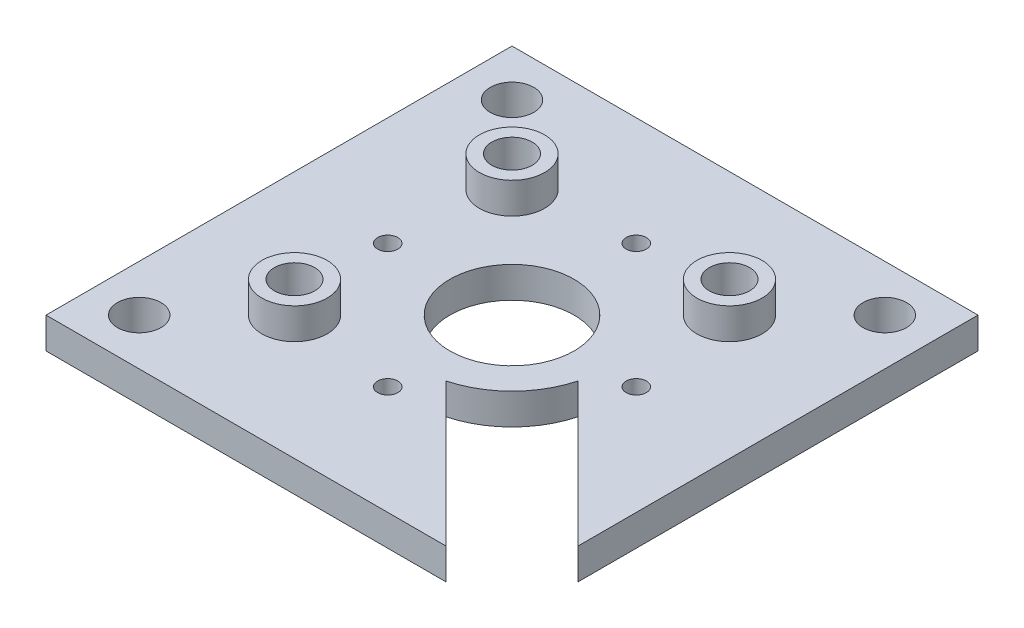
ISO-10303-21;
HEADER;
FILE_DESCRIPTION(('STEP AP214'),'2;1');
FILE_NAME('part.step','',(''),(''),'','','');
FILE_SCHEMA(('AUTOMOTIVE_DESIGN { 1 0 10303 214 1 1 1 1 }'));
ENDSEC;
DATA;
#1=APPLICATION_CONTEXT('core data for automotive mechanical design processes');
#2=APPLICATION_PROTOCOL_DEFINITION('international standard','automotive_design',2000,#1);
#3=PRODUCT_CONTEXT('',#1,'mechanical');
#4=PRODUCT('Part','Part','',(#3));
#5=PRODUCT_RELATED_PRODUCT_CATEGORY('part','',(#4));
#6=PRODUCT_DEFINITION_FORMATION('','',#4);
#7=PRODUCT_DEFINITION_CONTEXT('part definition',#1,'design');
#8=PRODUCT_DEFINITION('design','',#6,#7);
#9=PRODUCT_DEFINITION_SHAPE('','',#8);
#10=(LENGTH_UNIT() NAMED_UNIT(*) SI_UNIT(.MILLI.,.METRE.));
#11=(NAMED_UNIT(*) PLANE_ANGLE_UNIT() SI_UNIT($,.RADIAN.));
#12=(NAMED_UNIT(*) SI_UNIT($,.STERADIAN.) SOLID_ANGLE_UNIT());
#13=UNCERTAINTY_MEASURE_WITH_UNIT(LENGTH_MEASURE(1.E-05),#10,'distance_accuracy_value','');
#14=(GEOMETRIC_REPRESENTATION_CONTEXT(3) GLOBAL_UNCERTAINTY_ASSIGNED_CONTEXT((#13)) GLOBAL_UNIT_ASSIGNED_CONTEXT((#10,
#11,#12)) REPRESENTATION_CONTEXT('',''));
#15=CARTESIAN_POINT('',(0.,0.,0.));
#16=DIRECTION('',(0.,0.,1.));
#17=DIRECTION('',(1.,0.,0.));
#18=AXIS2_PLACEMENT_3D('',#15,#16,#17);
#19=CARTESIAN_POINT('',(0.,0.,0.));
#20=DIRECTION('',(0.,1.,0.));
#21=DIRECTION('',(0.,0.,1.));
#22=AXIS2_PLACEMENT_3D('',#19,#20,#21);
#23=PLANE('',#22);
#24=CARTESIAN_POINT('',(8.,0.,0.));
#25=DIRECTION('',(0.,1.,0.));
#26=DIRECTION('',(0.,0.,1.));
#27=AXIS2_PLACEMENT_3D('',#24,#25,#26);
#28=CIRCLE('',#27,0.649999999999999);
#29=CARTESIAN_POINT('',(8.,0.,0.649999999999999));
#30=VERTEX_POINT('',#29);
#31=EDGE_CURVE('E142',#30,#30,#28,.T.);
#32=ORIENTED_EDGE('',*,*,#31,.T.);
#33=EDGE_LOOP('',(#32));
#34=FACE_BOUND('',#33,.T.);
#35=CARTESIAN_POINT('',(0.,0.,8.));
#36=DIRECTION('',(0.,1.,0.));
#37=DIRECTION('',(0.,0.,1.));
#38=AXIS2_PLACEMENT_3D('',#35,#36,#37);
#39=CIRCLE('',#38,0.649999999999998);
#40=CARTESIAN_POINT('',(0.,0.,8.65));
#41=VERTEX_POINT('',#40);
#42=EDGE_CURVE('E147',#41,#41,#39,.T.);
#43=ORIENTED_EDGE('',*,*,#42,.T.);
#44=EDGE_LOOP('',(#43));
#45=FACE_BOUND('',#44,.T.);
#46=CARTESIAN_POINT('',(-8.,0.,0.));
#47=DIRECTION('',(0.,1.,0.));
#48=DIRECTION('',(0.,0.,1.));
#49=AXIS2_PLACEMENT_3D('',#46,#47,#48);
#50=CIRCLE('',#49,0.649999999999999);
#51=CARTESIAN_POINT('',(-8.,0.,0.649999999999944));
#52=VERTEX_POINT('',#51);
#53=EDGE_CURVE('E245',#52,#52,#50,.T.);
#54=ORIENTED_EDGE('',*,*,#53,.T.);
#55=EDGE_LOOP('',(#54));
#56=FACE_BOUND('',#55,.T.);
#57=CARTESIAN_POINT('',(0.,0.,-8.));
#58=DIRECTION('',(0.,1.,0.));
#59=DIRECTION('',(0.,0.,1.));
#60=AXIS2_PLACEMENT_3D('',#57,#58,#59);
#61=CIRCLE('',#60,0.649999999999999);
#62=CARTESIAN_POINT('',(0.,0.,-7.35));
#63=VERTEX_POINT('',#62);
#64=EDGE_CURVE('E238',#63,#63,#61,.T.);
#65=ORIENTED_EDGE('',*,*,#64,.T.);
#66=EDGE_LOOP('',(#65));
#67=FACE_BOUND('',#66,.T.);
#68=CARTESIAN_POINT('',(0.,0.,0.));
#69=DIRECTION('',(0.,1.,0.));
#70=DIRECTION('',(0.,0.,1.));
#71=AXIS2_PLACEMENT_3D('',#68,#69,#70);
#72=CIRCLE('',#71,4.);
#73=CARTESIAN_POINT('',(0.,0.,4.));
#74=VERTEX_POINT('',#73);
#75=EDGE_CURVE('E234',#74,#74,#72,.T.);
#76=ORIENTED_EDGE('',*,*,#75,.T.);
#77=EDGE_LOOP('',(#76));
#78=FACE_BOUND('',#77,.T.);
#79=CARTESIAN_POINT('',(12.,0.,-12.));
#80=DIRECTION('',(0.,1.,0.));
#81=DIRECTION('',(0.,0.,1.));
#82=AXIS2_PLACEMENT_3D('',#79,#80,#81);
#83=CIRCLE('',#82,1.4);
#84=CARTESIAN_POINT('',(12.,0.,-10.6));
#85=VERTEX_POINT('',#84);
#86=EDGE_CURVE('E229',#85,#85,#83,.T.);
#87=ORIENTED_EDGE('',*,*,#86,.T.);
#88=EDGE_LOOP('',(#87));
#89=FACE_BOUND('',#88,.T.);
#90=CARTESIAN_POINT('',(-12.,0.,-12.));
#91=DIRECTION('',(0.,1.,0.));
#92=DIRECTION('',(0.,0.,1.));
#93=AXIS2_PLACEMENT_3D('',#90,#91,#92);
#94=CIRCLE('',#93,1.4);
#95=CARTESIAN_POINT('',(-12.,0.,-10.6));
#96=VERTEX_POINT('',#95);
#97=EDGE_CURVE('E223',#96,#96,#94,.F.);
#98=ORIENTED_EDGE('',*,*,#97,.F.);
#99=EDGE_LOOP('',(#98));
#100=FACE_BOUND('',#99,.T.);
#101=CARTESIAN_POINT('',(-12.,0.,12.));
#102=DIRECTION('',(0.,1.,0.));
#103=DIRECTION('',(0.,0.,1.));
#104=AXIS2_PLACEMENT_3D('',#101,#102,#103);
#105=CIRCLE('',#104,1.4);
#106=CARTESIAN_POINT('',(-12.,0.,13.4));
#107=VERTEX_POINT('',#106);
#108=EDGE_CURVE('E222',#107,#107,#105,.T.);
#109=ORIENTED_EDGE('',*,*,#108,.T.);
#110=EDGE_LOOP('',(#109));
#111=FACE_BOUND('',#110,.T.);
#112=CARTESIAN_POINT('',(-7.00000000000001,0.,-6.99999999999999));
#113=DIRECTION('',(0.,1.,0.));
#114=DIRECTION('',(0.,0.,1.));
#115=AXIS2_PLACEMENT_3D('',#112,#113,#114);
#116=CIRCLE('',#115,1.3);
#117=CARTESIAN_POINT('',(-7.00000000000001,0.,-5.69999999999999));
#118=VERTEX_POINT('',#117);
#119=EDGE_CURVE('E319',#118,#118,#116,.F.);
#120=ORIENTED_EDGE('',*,*,#119,.F.);
#121=EDGE_LOOP('',(#120));
#122=FACE_BOUND('',#121,.T.);
#123=CARTESIAN_POINT('',(6.99999999999999,0.,-7.00000000000002));
#124=DIRECTION('',(0.,1.,0.));
#125=DIRECTION('',(0.,0.,1.));
#126=AXIS2_PLACEMENT_3D('',#123,#124,#125);
#127=CIRCLE('',#126,1.3);
#128=CARTESIAN_POINT('',(6.99999999999999,0.,-5.70000000000002));
#129=VERTEX_POINT('',#128);
#130=EDGE_CURVE('E302',#129,#129,#127,.F.);
#131=ORIENTED_EDGE('',*,*,#130,.F.);
#132=EDGE_LOOP('',(#131));
#133=FACE_BOUND('',#132,.T.);
#134=CARTESIAN_POINT('',(-6.99999999999999,0.,7.00000000000002));
#135=DIRECTION('',(0.,1.,0.));
#136=DIRECTION('',(0.,0.,1.));
#137=AXIS2_PLACEMENT_3D('',#134,#135,#136);
#138=CIRCLE('',#137,1.3);
#139=CARTESIAN_POINT('',(-6.99999999999999,0.,8.30000000000002));
#140=VERTEX_POINT('',#139);
#141=EDGE_CURVE('E313',#140,#140,#138,.F.);
#142=ORIENTED_EDGE('',*,*,#141,.F.);
#143=EDGE_LOOP('',(#142));
#144=FACE_BOUND('',#143,.T.);
#145=DIRECTION('',(-0.707106781186548,0.,-0.707106781186548));
#146=VECTOR('',#145,1.);
#147=CARTESIAN_POINT('',(-2.12132034355964,0.,2.12132034355964));
#148=LINE('',#147,#146);
#149=CARTESIAN_POINT('',(10.7573593128807,0.,15.));
#150=VERTEX_POINT('',#149);
#151=CARTESIAN_POINT('',(1.55291427061513,0.,5.79555495773441));
#152=VERTEX_POINT('',#151);
#153=EDGE_CURVE('E304',#150,#152,#148,.T.);
#154=ORIENTED_EDGE('',*,*,#153,.F.);
#155=DIRECTION('',(1.,0.,0.));
#156=VECTOR('',#155,1.);
#157=CARTESIAN_POINT('',(0.,0.,15.));
#158=LINE('',#157,#156);
#159=CARTESIAN_POINT('',(-15.,0.,15.));
#160=VERTEX_POINT('',#159);
#161=EDGE_CURVE('E94',#160,#150,#158,.T.);
#162=ORIENTED_EDGE('',*,*,#161,.F.);
#163=DIRECTION('',(0.,0.,1.));
#164=VECTOR('',#163,1.);
#165=CARTESIAN_POINT('',(-15.,0.,0.));
#166=LINE('',#165,#164);
#167=CARTESIAN_POINT('',(-15.,0.,-15.));
#168=VERTEX_POINT('',#167);
#169=EDGE_CURVE('E143',#168,#160,#166,.T.);
#170=ORIENTED_EDGE('',*,*,#169,.F.);
#171=DIRECTION('',(1.,0.,0.));
#172=VECTOR('',#171,1.);
#173=CARTESIAN_POINT('',(0.,0.,-15.));
#174=LINE('',#173,#172);
#175=CARTESIAN_POINT('',(15.,0.,-15.));
#176=VERTEX_POINT('',#175);
#177=EDGE_CURVE('E136',#168,#176,#174,.T.);
#178=ORIENTED_EDGE('',*,*,#177,.T.);
#179=DIRECTION('',(0.,0.,1.));
#180=VECTOR('',#179,1.);
#181=CARTESIAN_POINT('',(15.,0.,0.));
#182=LINE('',#181,#180);
#183=CARTESIAN_POINT('',(15.,0.,10.7573593128807));
#184=VERTEX_POINT('',#183);
#185=EDGE_CURVE('E131',#176,#184,#182,.T.);
#186=ORIENTED_EDGE('',*,*,#185,.T.);
#187=DIRECTION('',(-0.707106781186548,0.,-0.707106781186548));
#188=VECTOR('',#187,1.);
#189=CARTESIAN_POINT('',(2.12132034355964,0.,-2.12132034355964));
#190=LINE('',#189,#188);
#191=CARTESIAN_POINT('',(5.79555495773441,0.,1.55291427061513));
#192=VERTEX_POINT('',#191);
#193=EDGE_CURVE('E118',#184,#192,#190,.T.);
#194=ORIENTED_EDGE('',*,*,#193,.T.);
#195=CARTESIAN_POINT('',(0.,0.,0.));
#196=DIRECTION('',(0.,1.,0.));
#197=DIRECTION('',(0.,0.,1.));
#198=AXIS2_PLACEMENT_3D('',#195,#196,#197);
#199=CIRCLE('',#198,6.00000000000001);
#200=EDGE_CURVE('E305',#152,#192,#199,.T.);
#201=ORIENTED_EDGE('',*,*,#200,.F.);
#202=EDGE_LOOP('',(#154,#162,#170,#178,#186,#194,#201));
#203=FACE_BOUND('',#202,.T.);
#204=ADVANCED_FACE('F46',(#34,#45,#56,#67,#78,#89,#100,#111,#122,#133,#144,#203),#23,.F.);
#205=CARTESIAN_POINT('',(15.,2.,0.));
#206=DIRECTION('',(1.,0.,0.));
#207=DIRECTION('',(0.,0.,-1.));
#208=AXIS2_PLACEMENT_3D('',#205,#206,#207);
#209=PLANE('',#208);
#210=DIRECTION('',(0.,1.,0.));
#211=VECTOR('',#210,1.);
#212=CARTESIAN_POINT('',(15.,-19.0170510128898,10.7573593128807));
#213=LINE('',#212,#211);
#214=CARTESIAN_POINT('',(15.,2.,10.7573593128807));
#215=VERTEX_POINT('',#214);
#216=EDGE_CURVE('E124',#184,#215,#213,.T.);
#217=ORIENTED_EDGE('',*,*,#216,.F.);
#218=ORIENTED_EDGE('',*,*,#185,.F.);
#219=DIRECTION('',(0.,-1.,0.));
#220=VECTOR('',#219,1.);
#221=CARTESIAN_POINT('',(15.,2.,-15.));
#222=LINE('',#221,#220);
#223=CARTESIAN_POINT('',(15.,2.,-15.));
#224=VERTEX_POINT('',#223);
#225=EDGE_CURVE('E49',#224,#176,#222,.T.);
#226=ORIENTED_EDGE('',*,*,#225,.F.);
#227=DIRECTION('',(0.,0.,1.));
#228=VECTOR('',#227,1.);
#229=CARTESIAN_POINT('',(15.,2.,0.));
#230=LINE('',#229,#228);
#231=EDGE_CURVE('E134',#224,#215,#230,.T.);
#232=ORIENTED_EDGE('',*,*,#231,.T.);
#233=EDGE_LOOP('',(#217,#218,#226,#232));
#234=FACE_BOUND('',#233,.T.);
#235=ADVANCED_FACE('F126',(#234),#209,.T.);
#236=CARTESIAN_POINT('',(0.,2.,-15.));
#237=DIRECTION('',(0.,0.,-1.));
#238=DIRECTION('',(-1.,0.,0.));
#239=AXIS2_PLACEMENT_3D('',#236,#237,#238);
#240=PLANE('',#239);
#241=ORIENTED_EDGE('',*,*,#177,.F.);
#242=DIRECTION('',(0.,-1.,0.));
#243=VECTOR('',#242,1.);
#244=CARTESIAN_POINT('',(-15.,2.,-15.));
#245=LINE('',#244,#243);
#246=CARTESIAN_POINT('',(-15.,2.,-15.));
#247=VERTEX_POINT('',#246);
#248=EDGE_CURVE('E158',#247,#168,#245,.T.);
#249=ORIENTED_EDGE('',*,*,#248,.F.);
#250=DIRECTION('',(1.,0.,0.));
#251=VECTOR('',#250,1.);
#252=CARTESIAN_POINT('',(0.,2.,-15.));
#253=LINE('',#252,#251);
#254=EDGE_CURVE('E212',#247,#224,#253,.T.);
#255=ORIENTED_EDGE('',*,*,#254,.T.);
#256=ORIENTED_EDGE('',*,*,#225,.T.);
#257=EDGE_LOOP('',(#241,#249,#255,#256));
#258=FACE_BOUND('',#257,.T.);
#259=ADVANCED_FACE('F274',(#258),#240,.T.);
#260=CARTESIAN_POINT('',(-15.,2.,0.));
#261=DIRECTION('',(1.,0.,0.));
#262=DIRECTION('',(0.,0.,-1.));
#263=AXIS2_PLACEMENT_3D('',#260,#261,#262);
#264=PLANE('',#263);
#265=ORIENTED_EDGE('',*,*,#169,.T.);
#266=DIRECTION('',(0.,-1.,0.));
#267=VECTOR('',#266,1.);
#268=CARTESIAN_POINT('',(-15.,2.,15.));
#269=LINE('',#268,#267);
#270=CARTESIAN_POINT('',(-15.,2.,15.));
#271=VERTEX_POINT('',#270);
#272=EDGE_CURVE('E160',#271,#160,#269,.T.);
#273=ORIENTED_EDGE('',*,*,#272,.F.);
#274=DIRECTION('',(0.,0.,1.));
#275=VECTOR('',#274,1.);
#276=CARTESIAN_POINT('',(-15.,2.,0.));
#277=LINE('',#276,#275);
#278=EDGE_CURVE('E216',#247,#271,#277,.T.);
#279=ORIENTED_EDGE('',*,*,#278,.F.);
#280=ORIENTED_EDGE('',*,*,#248,.T.);
#281=EDGE_LOOP('',(#265,#273,#279,#280));
#282=FACE_BOUND('',#281,.T.);
#283=ADVANCED_FACE('F282',(#282),#264,.F.);
#284=CARTESIAN_POINT('',(0.,2.,15.));
#285=DIRECTION('',(0.,0.,-1.));
#286=DIRECTION('',(-1.,0.,0.));
#287=AXIS2_PLACEMENT_3D('',#284,#285,#286);
#288=PLANE('',#287);
#289=ORIENTED_EDGE('',*,*,#161,.T.);
#290=DIRECTION('',(0.,1.,0.));
#291=VECTOR('',#290,1.);
#292=CARTESIAN_POINT('',(10.7573593128807,-19.0170510128898,15.));
#293=LINE('',#292,#291);
#294=CARTESIAN_POINT('',(10.7573593128807,2.,15.));
#295=VERTEX_POINT('',#294);
#296=EDGE_CURVE('E135',#150,#295,#293,.T.);
#297=ORIENTED_EDGE('',*,*,#296,.T.);
#298=DIRECTION('',(1.,0.,0.));
#299=VECTOR('',#298,1.);
#300=CARTESIAN_POINT('',(0.,2.,15.));
#301=LINE('',#300,#299);
#302=EDGE_CURVE('E75',#271,#295,#301,.T.);
#303=ORIENTED_EDGE('',*,*,#302,.F.);
#304=ORIENTED_EDGE('',*,*,#272,.T.);
#305=EDGE_LOOP('',(#289,#297,#303,#304));
#306=FACE_BOUND('',#305,.T.);
#307=ADVANCED_FACE('F263',(#306),#288,.F.);
#308=CARTESIAN_POINT('',(8.,2.,0.));
#309=DIRECTION('',(0.,-1.,0.));
#310=DIRECTION('',(0.,0.,-1.));
#311=AXIS2_PLACEMENT_3D('',#308,#309,#310);
#312=CYLINDRICAL_SURFACE('',#311,0.649999999999999);
#313=CARTESIAN_POINT('',(8.,2.,0.));
#314=DIRECTION('',(0.,1.,0.));
#315=DIRECTION('',(0.,0.,1.));
#316=AXIS2_PLACEMENT_3D('',#313,#314,#315);
#317=CIRCLE('',#316,0.649999999999999);
#318=CARTESIAN_POINT('',(8.,2.,0.649999999999999));
#319=VERTEX_POINT('',#318);
#320=EDGE_CURVE('E210',#319,#319,#317,.T.);
#321=ORIENTED_EDGE('',*,*,#320,.T.);
#322=EDGE_LOOP('',(#321));
#323=FACE_BOUND('',#322,.T.);
#324=ORIENTED_EDGE('',*,*,#31,.F.);
#325=EDGE_LOOP('',(#324));
#326=FACE_BOUND('',#325,.T.);
#327=ADVANCED_FACE('F251',(#323,#326),#312,.F.);
#328=CARTESIAN_POINT('',(0.,2.,8.));
#329=DIRECTION('',(0.,-1.,0.));
#330=DIRECTION('',(0.,0.,-1.));
#331=AXIS2_PLACEMENT_3D('',#328,#329,#330);
#332=CYLINDRICAL_SURFACE('',#331,0.649999999999998);
#333=CARTESIAN_POINT('',(0.,2.,8.));
#334=DIRECTION('',(0.,1.,0.));
#335=DIRECTION('',(0.,0.,1.));
#336=AXIS2_PLACEMENT_3D('',#333,#334,#335);
#337=CIRCLE('',#336,0.649999999999998);
#338=CARTESIAN_POINT('',(0.,2.,8.65));
#339=VERTEX_POINT('',#338);
#340=EDGE_CURVE('E205',#339,#339,#337,.T.);
#341=ORIENTED_EDGE('',*,*,#340,.T.);
#342=EDGE_LOOP('',(#341));
#343=FACE_BOUND('',#342,.T.);
#344=ORIENTED_EDGE('',*,*,#42,.F.);
#345=EDGE_LOOP('',(#344));
#346=FACE_BOUND('',#345,.T.);
#347=ADVANCED_FACE('F252',(#343,#346),#332,.F.);
#348=CARTESIAN_POINT('',(-8.,2.,0.));
#349=DIRECTION('',(0.,-1.,0.));
#350=DIRECTION('',(0.,0.,-1.));
#351=AXIS2_PLACEMENT_3D('',#348,#349,#350);
#352=CYLINDRICAL_SURFACE('',#351,0.649999999999999);
#353=CARTESIAN_POINT('',(-8.,2.,0.));
#354=DIRECTION('',(0.,1.,0.));
#355=DIRECTION('',(0.,0.,1.));
#356=AXIS2_PLACEMENT_3D('',#353,#354,#355);
#357=CIRCLE('',#356,0.649999999999999);
#358=CARTESIAN_POINT('',(-8.,2.,0.649999999999944));
#359=VERTEX_POINT('',#358);
#360=EDGE_CURVE('E198',#359,#359,#357,.T.);
#361=ORIENTED_EDGE('',*,*,#360,.T.);
#362=EDGE_LOOP('',(#361));
#363=FACE_BOUND('',#362,.T.);
#364=ORIENTED_EDGE('',*,*,#53,.F.);
#365=EDGE_LOOP('',(#364));
#366=FACE_BOUND('',#365,.T.);
#367=ADVANCED_FACE('F254',(#363,#366),#352,.F.);
#368=CARTESIAN_POINT('',(0.,2.,-8.));
#369=DIRECTION('',(0.,-1.,0.));
#370=DIRECTION('',(0.,0.,-1.));
#371=AXIS2_PLACEMENT_3D('',#368,#369,#370);
#372=CYLINDRICAL_SURFACE('',#371,0.649999999999999);
#373=CARTESIAN_POINT('',(0.,2.,-8.));
#374=DIRECTION('',(0.,1.,0.));
#375=DIRECTION('',(0.,0.,1.));
#376=AXIS2_PLACEMENT_3D('',#373,#374,#375);
#377=CIRCLE('',#376,0.649999999999999);
#378=CARTESIAN_POINT('',(0.,2.,-7.35));
#379=VERTEX_POINT('',#378);
#380=EDGE_CURVE('E191',#379,#379,#377,.T.);
#381=ORIENTED_EDGE('',*,*,#380,.T.);
#382=EDGE_LOOP('',(#381));
#383=FACE_BOUND('',#382,.T.);
#384=ORIENTED_EDGE('',*,*,#64,.F.);
#385=EDGE_LOOP('',(#384));
#386=FACE_BOUND('',#385,.T.);
#387=ADVANCED_FACE('F261',(#383,#386),#372,.F.);
#388=CARTESIAN_POINT('',(0.,2.,0.));
#389=DIRECTION('',(0.,-1.,0.));
#390=DIRECTION('',(0.,0.,-1.));
#391=AXIS2_PLACEMENT_3D('',#388,#389,#390);
#392=CYLINDRICAL_SURFACE('',#391,4.);
#393=CARTESIAN_POINT('',(0.,2.,0.));
#394=DIRECTION('',(0.,1.,0.));
#395=DIRECTION('',(0.,0.,1.));
#396=AXIS2_PLACEMENT_3D('',#393,#394,#395);
#397=CIRCLE('',#396,4.);
#398=CARTESIAN_POINT('',(0.,2.,4.));
#399=VERTEX_POINT('',#398);
#400=EDGE_CURVE('E193',#399,#399,#397,.T.);
#401=ORIENTED_EDGE('',*,*,#400,.T.);
#402=EDGE_LOOP('',(#401));
#403=FACE_BOUND('',#402,.T.);
#404=ORIENTED_EDGE('',*,*,#75,.F.);
#405=EDGE_LOOP('',(#404));
#406=FACE_BOUND('',#405,.T.);
#407=ADVANCED_FACE('F476',(#403,#406),#392,.F.);
#408=CARTESIAN_POINT('',(12.,2.,-12.));
#409=DIRECTION('',(0.,-1.,0.));
#410=DIRECTION('',(0.,0.,-1.));
#411=AXIS2_PLACEMENT_3D('',#408,#409,#410);
#412=CYLINDRICAL_SURFACE('',#411,1.4);
#413=CARTESIAN_POINT('',(12.,2.,-12.));
#414=DIRECTION('',(0.,1.,0.));
#415=DIRECTION('',(0.,0.,1.));
#416=AXIS2_PLACEMENT_3D('',#413,#414,#415);
#417=CIRCLE('',#416,1.4);
#418=CARTESIAN_POINT('',(12.,2.,-10.6));
#419=VERTEX_POINT('',#418);
#420=EDGE_CURVE('E190',#419,#419,#417,.T.);
#421=ORIENTED_EDGE('',*,*,#420,.T.);
#422=EDGE_LOOP('',(#421));
#423=FACE_BOUND('',#422,.T.);
#424=ORIENTED_EDGE('',*,*,#86,.F.);
#425=EDGE_LOOP('',(#424));
#426=FACE_BOUND('',#425,.T.);
#427=ADVANCED_FACE('F488',(#423,#426),#412,.F.);
#428=CARTESIAN_POINT('',(-12.,2.,-12.));
#429=DIRECTION('',(0.,-1.,0.));
#430=DIRECTION('',(0.,0.,-1.));
#431=AXIS2_PLACEMENT_3D('',#428,#429,#430);
#432=CYLINDRICAL_SURFACE('',#431,1.4);
#433=CARTESIAN_POINT('',(-12.,2.,-12.));
#434=DIRECTION('',(0.,1.,0.));
#435=DIRECTION('',(0.,0.,1.));
#436=AXIS2_PLACEMENT_3D('',#433,#434,#435);
#437=CIRCLE('',#436,1.4);
#438=CARTESIAN_POINT('',(-12.,2.,-10.6));
#439=VERTEX_POINT('',#438);
#440=EDGE_CURVE('E182',#439,#439,#437,.F.);
#441=ORIENTED_EDGE('',*,*,#440,.F.);
#442=EDGE_LOOP('',(#441));
#443=FACE_BOUND('',#442,.T.);
#444=ORIENTED_EDGE('',*,*,#97,.T.);
#445=EDGE_LOOP('',(#444));
#446=FACE_BOUND('',#445,.T.);
#447=ADVANCED_FACE('F496',(#443,#446),#432,.F.);
#448=CARTESIAN_POINT('',(-12.,2.,12.));
#449=DIRECTION('',(0.,-1.,0.));
#450=DIRECTION('',(0.,0.,-1.));
#451=AXIS2_PLACEMENT_3D('',#448,#449,#450);
#452=CYLINDRICAL_SURFACE('',#451,1.4);
#453=CARTESIAN_POINT('',(-12.,2.,12.));
#454=DIRECTION('',(0.,1.,0.));
#455=DIRECTION('',(0.,0.,1.));
#456=AXIS2_PLACEMENT_3D('',#453,#454,#455);
#457=CIRCLE('',#456,1.4);
#458=CARTESIAN_POINT('',(-12.,2.,13.4));
#459=VERTEX_POINT('',#458);
#460=EDGE_CURVE('E159',#459,#459,#457,.T.);
#461=ORIENTED_EDGE('',*,*,#460,.T.);
#462=EDGE_LOOP('',(#461));
#463=FACE_BOUND('',#462,.T.);
#464=ORIENTED_EDGE('',*,*,#108,.F.);
#465=EDGE_LOOP('',(#464));
#466=FACE_BOUND('',#465,.T.);
#467=ADVANCED_FACE('F48',(#463,#466),#452,.F.);
#468=CARTESIAN_POINT('',(0.,2.,0.));
#469=DIRECTION('',(0.,1.,0.));
#470=DIRECTION('',(0.,0.,1.));
#471=AXIS2_PLACEMENT_3D('',#468,#469,#470);
#472=PLANE('',#471);
#473=CARTESIAN_POINT('',(0.,2.,0.));
#474=DIRECTION('',(0.,1.,0.));
#475=DIRECTION('',(0.,0.,1.));
#476=AXIS2_PLACEMENT_3D('',#473,#474,#475);
#477=CIRCLE('',#476,6.00000000000001);
#478=CARTESIAN_POINT('',(5.79555495773441,2.,1.55291427061513));
#479=VERTEX_POINT('',#478);
#480=CARTESIAN_POINT('',(1.55291427061513,2.,5.79555495773441));
#481=VERTEX_POINT('',#480);
#482=EDGE_CURVE('E295',#479,#481,#477,.F.);
#483=ORIENTED_EDGE('',*,*,#482,.F.);
#484=DIRECTION('',(0.707106781186548,0.,0.707106781186548));
#485=VECTOR('',#484,1.);
#486=CARTESIAN_POINT('',(2.12132034355964,2.,-2.12132034355964));
#487=LINE('',#486,#485);
#488=EDGE_CURVE('E137',#479,#215,#487,.T.);
#489=ORIENTED_EDGE('',*,*,#488,.T.);
#490=ORIENTED_EDGE('',*,*,#231,.F.);
#491=ORIENTED_EDGE('',*,*,#254,.F.);
#492=ORIENTED_EDGE('',*,*,#278,.T.);
#493=ORIENTED_EDGE('',*,*,#302,.T.);
#494=DIRECTION('',(0.707106781186548,0.,0.707106781186548));
#495=VECTOR('',#494,1.);
#496=CARTESIAN_POINT('',(-2.12132034355964,2.,2.12132034355964));
#497=LINE('',#496,#495);
#498=EDGE_CURVE('E312',#481,#295,#497,.T.);
#499=ORIENTED_EDGE('',*,*,#498,.F.);
#500=EDGE_LOOP('',(#483,#489,#490,#491,#492,#493,#499));
#501=FACE_BOUND('',#500,.T.);
#502=CARTESIAN_POINT('',(-6.99999999999999,2.,7.00000000000002));
#503=DIRECTION('',(0.,1.,0.));
#504=DIRECTION('',(0.,0.,1.));
#505=AXIS2_PLACEMENT_3D('',#502,#503,#504);
#506=CIRCLE('',#505,2.1);
#507=CARTESIAN_POINT('',(-6.99999999999999,2.,9.10000000000002));
#508=VERTEX_POINT('',#507);
#509=EDGE_CURVE('E11',#508,#508,#506,.T.);
#510=ORIENTED_EDGE('',*,*,#509,.F.);
#511=EDGE_LOOP('',(#510));
#512=FACE_BOUND('',#511,.T.);
#513=CARTESIAN_POINT('',(-7.00000000000001,2.,-6.99999999999999));
#514=DIRECTION('',(0.,1.,0.));
#515=DIRECTION('',(0.,0.,1.));
#516=AXIS2_PLACEMENT_3D('',#513,#514,#515);
#517=CIRCLE('',#516,2.1);
#518=CARTESIAN_POINT('',(-7.00000000000001,2.,-4.89999999999999));
#519=VERTEX_POINT('',#518);
#520=EDGE_CURVE('E57',#519,#519,#517,.T.);
#521=ORIENTED_EDGE('',*,*,#520,.F.);
#522=EDGE_LOOP('',(#521));
#523=FACE_BOUND('',#522,.T.);
#524=CARTESIAN_POINT('',(6.99999999999999,2.,-7.00000000000002));
#525=DIRECTION('',(0.,1.,0.));
#526=DIRECTION('',(0.,0.,1.));
#527=AXIS2_PLACEMENT_3D('',#524,#525,#526);
#528=CIRCLE('',#527,2.1);
#529=CARTESIAN_POINT('',(6.99999999999999,2.,-4.90000000000002));
#530=VERTEX_POINT('',#529);
#531=EDGE_CURVE('E164',#530,#530,#528,.T.);
#532=ORIENTED_EDGE('',*,*,#531,.F.);
#533=EDGE_LOOP('',(#532));
#534=FACE_BOUND('',#533,.T.);
#535=ORIENTED_EDGE('',*,*,#460,.F.);
#536=EDGE_LOOP('',(#535));
#537=FACE_BOUND('',#536,.T.);
#538=ORIENTED_EDGE('',*,*,#440,.T.);
#539=EDGE_LOOP('',(#538));
#540=FACE_BOUND('',#539,.T.);
#541=ORIENTED_EDGE('',*,*,#420,.F.);
#542=EDGE_LOOP('',(#541));
#543=FACE_BOUND('',#542,.T.);
#544=ORIENTED_EDGE('',*,*,#400,.F.);
#545=EDGE_LOOP('',(#544));
#546=FACE_BOUND('',#545,.T.);
#547=ORIENTED_EDGE('',*,*,#380,.F.);
#548=EDGE_LOOP('',(#547));
#549=FACE_BOUND('',#548,.T.);
#550=ORIENTED_EDGE('',*,*,#360,.F.);
#551=EDGE_LOOP('',(#550));
#552=FACE_BOUND('',#551,.T.);
#553=ORIENTED_EDGE('',*,*,#340,.F.);
#554=EDGE_LOOP('',(#553));
#555=FACE_BOUND('',#554,.T.);
#556=ORIENTED_EDGE('',*,*,#320,.F.);
#557=EDGE_LOOP('',(#556));
#558=FACE_BOUND('',#557,.T.);
#559=ADVANCED_FACE('F277',(#501,#512,#523,#534,#537,#540,#543,#546,#549,#552,#555,#558),#472,.T.);
#560=CARTESIAN_POINT('',(6.99999999999999,4.,-7.00000000000002));
#561=DIRECTION('',(0.,-1.,0.));
#562=DIRECTION('',(0.,0.,-1.));
#563=AXIS2_PLACEMENT_3D('',#560,#561,#562);
#564=CYLINDRICAL_SURFACE('',#563,1.3);
#565=CARTESIAN_POINT('',(6.99999999999999,4.,-7.00000000000002));
#566=DIRECTION('',(0.,1.,0.));
#567=DIRECTION('',(0.,0.,1.));
#568=AXIS2_PLACEMENT_3D('',#565,#566,#567);
#569=CIRCLE('',#568,1.3);
#570=CARTESIAN_POINT('',(6.99999999999999,4.,-5.70000000000002));
#571=VERTEX_POINT('',#570);
#572=EDGE_CURVE('E321',#571,#571,#569,.T.);
#573=ORIENTED_EDGE('',*,*,#572,.T.);
#574=EDGE_LOOP('',(#573));
#575=FACE_BOUND('',#574,.T.);
#576=ORIENTED_EDGE('',*,*,#130,.T.);
#577=EDGE_LOOP('',(#576));
#578=FACE_BOUND('',#577,.T.);
#579=ADVANCED_FACE('F354',(#575,#578),#564,.F.);
#580=CARTESIAN_POINT('',(6.99999999999999,4.,-7.00000000000002));
#581=DIRECTION('',(0.,-1.,0.));
#582=DIRECTION('',(0.,0.,-1.));
#583=AXIS2_PLACEMENT_3D('',#580,#581,#582);
#584=CYLINDRICAL_SURFACE('',#583,2.1);
#585=CARTESIAN_POINT('',(6.99999999999999,4.,-7.00000000000002));
#586=DIRECTION('',(0.,1.,0.));
#587=DIRECTION('',(0.,0.,1.));
#588=AXIS2_PLACEMENT_3D('',#585,#586,#587);
#589=CIRCLE('',#588,2.1);
#590=CARTESIAN_POINT('',(6.99999999999999,4.,-4.90000000000002));
#591=VERTEX_POINT('',#590);
#592=EDGE_CURVE('E178',#591,#591,#589,.T.);
#593=ORIENTED_EDGE('',*,*,#592,.F.);
#594=EDGE_LOOP('',(#593));
#595=FACE_BOUND('',#594,.T.);
#596=ORIENTED_EDGE('',*,*,#531,.T.);
#597=EDGE_LOOP('',(#596));
#598=FACE_BOUND('',#597,.T.);
#599=ADVANCED_FACE('F350',(#595,#598),#584,.T.);
#600=CARTESIAN_POINT('',(0.,4.,0.));
#601=DIRECTION('',(0.,1.,0.));
#602=DIRECTION('',(0.,0.,1.));
#603=AXIS2_PLACEMENT_3D('',#600,#601,#602);
#604=PLANE('',#603);
#605=ORIENTED_EDGE('',*,*,#572,.F.);
#606=EDGE_LOOP('',(#605));
#607=FACE_BOUND('',#606,.T.);
#608=ORIENTED_EDGE('',*,*,#592,.T.);
#609=EDGE_LOOP('',(#608));
#610=FACE_BOUND('',#609,.T.);
#611=ADVANCED_FACE('F349',(#607,#610),#604,.T.);
#612=CARTESIAN_POINT('',(-7.00000000000001,4.,-6.99999999999999));
#613=DIRECTION('',(0.,-1.,0.));
#614=DIRECTION('',(0.,0.,-1.));
#615=AXIS2_PLACEMENT_3D('',#612,#613,#614);
#616=CYLINDRICAL_SURFACE('',#615,1.3);
#617=CARTESIAN_POINT('',(-7.00000000000001,4.,-6.99999999999999));
#618=DIRECTION('',(0.,1.,0.));
#619=DIRECTION('',(0.,0.,1.));
#620=AXIS2_PLACEMENT_3D('',#617,#618,#619);
#621=CIRCLE('',#620,1.3);
#622=CARTESIAN_POINT('',(-7.00000000000001,4.,-5.69999999999999));
#623=VERTEX_POINT('',#622);
#624=EDGE_CURVE('E331',#623,#623,#621,.T.);
#625=ORIENTED_EDGE('',*,*,#624,.T.);
#626=EDGE_LOOP('',(#625));
#627=FACE_BOUND('',#626,.T.);
#628=ORIENTED_EDGE('',*,*,#119,.T.);
#629=EDGE_LOOP('',(#628));
#630=FACE_BOUND('',#629,.T.);
#631=ADVANCED_FACE('F356',(#627,#630),#616,.F.);
#632=CARTESIAN_POINT('',(-7.00000000000001,4.,-6.99999999999999));
#633=DIRECTION('',(0.,-1.,0.));
#634=DIRECTION('',(0.,0.,-1.));
#635=AXIS2_PLACEMENT_3D('',#632,#633,#634);
#636=CYLINDRICAL_SURFACE('',#635,2.1);
#637=CARTESIAN_POINT('',(-7.00000000000001,4.,-6.99999999999999));
#638=DIRECTION('',(0.,1.,0.));
#639=DIRECTION('',(0.,0.,1.));
#640=AXIS2_PLACEMENT_3D('',#637,#638,#639);
#641=CIRCLE('',#640,2.1);
#642=CARTESIAN_POINT('',(-7.00000000000001,4.,-4.89999999999999));
#643=VERTEX_POINT('',#642);
#644=EDGE_CURVE('E330',#643,#643,#641,.T.);
#645=ORIENTED_EDGE('',*,*,#644,.F.);
#646=EDGE_LOOP('',(#645));
#647=FACE_BOUND('',#646,.T.);
#648=ORIENTED_EDGE('',*,*,#520,.T.);
#649=EDGE_LOOP('',(#648));
#650=FACE_BOUND('',#649,.T.);
#651=ADVANCED_FACE('F362',(#647,#650),#636,.T.);
#652=CARTESIAN_POINT('',(0.,4.,0.));
#653=DIRECTION('',(0.,1.,0.));
#654=DIRECTION('',(0.,0.,1.));
#655=AXIS2_PLACEMENT_3D('',#652,#653,#654);
#656=PLANE('',#655);
#657=ORIENTED_EDGE('',*,*,#624,.F.);
#658=EDGE_LOOP('',(#657));
#659=FACE_BOUND('',#658,.T.);
#660=ORIENTED_EDGE('',*,*,#644,.T.);
#661=EDGE_LOOP('',(#660));
#662=FACE_BOUND('',#661,.T.);
#663=ADVANCED_FACE('F367',(#659,#662),#656,.T.);
#664=CARTESIAN_POINT('',(-6.99999999999999,4.,7.00000000000002));
#665=DIRECTION('',(0.,-1.,0.));
#666=DIRECTION('',(0.,0.,-1.));
#667=AXIS2_PLACEMENT_3D('',#664,#665,#666);
#668=CYLINDRICAL_SURFACE('',#667,1.3);
#669=CARTESIAN_POINT('',(-6.99999999999999,4.,7.00000000000002));
#670=DIRECTION('',(0.,1.,0.));
#671=DIRECTION('',(0.,0.,1.));
#672=AXIS2_PLACEMENT_3D('',#669,#670,#671);
#673=CIRCLE('',#672,1.3);
#674=CARTESIAN_POINT('',(-6.99999999999999,4.,8.30000000000002));
#675=VERTEX_POINT('',#674);
#676=EDGE_CURVE('E326',#675,#675,#673,.T.);
#677=ORIENTED_EDGE('',*,*,#676,.T.);
#678=EDGE_LOOP('',(#677));
#679=FACE_BOUND('',#678,.T.);
#680=ORIENTED_EDGE('',*,*,#141,.T.);
#681=EDGE_LOOP('',(#680));
#682=FACE_BOUND('',#681,.T.);
#683=ADVANCED_FACE('F373',(#679,#682),#668,.F.);
#684=CARTESIAN_POINT('',(-6.99999999999999,4.,7.00000000000002));
#685=DIRECTION('',(0.,-1.,0.));
#686=DIRECTION('',(0.,0.,-1.));
#687=AXIS2_PLACEMENT_3D('',#684,#685,#686);
#688=CYLINDRICAL_SURFACE('',#687,2.1);
#689=CARTESIAN_POINT('',(-6.99999999999999,4.,7.00000000000002));
#690=DIRECTION('',(0.,1.,0.));
#691=DIRECTION('',(0.,0.,1.));
#692=AXIS2_PLACEMENT_3D('',#689,#690,#691);
#693=CIRCLE('',#692,2.1);
#694=CARTESIAN_POINT('',(-6.99999999999999,4.,9.10000000000002));
#695=VERTEX_POINT('',#694);
#696=EDGE_CURVE('E228',#695,#695,#693,.T.);
#697=ORIENTED_EDGE('',*,*,#696,.F.);
#698=EDGE_LOOP('',(#697));
#699=FACE_BOUND('',#698,.T.);
#700=ORIENTED_EDGE('',*,*,#509,.T.);
#701=EDGE_LOOP('',(#700));
#702=FACE_BOUND('',#701,.T.);
#703=ADVANCED_FACE('F380',(#699,#702),#688,.T.);
#704=CARTESIAN_POINT('',(0.,4.,0.));
#705=DIRECTION('',(0.,1.,0.));
#706=DIRECTION('',(0.,0.,1.));
#707=AXIS2_PLACEMENT_3D('',#704,#705,#706);
#708=PLANE('',#707);
#709=ORIENTED_EDGE('',*,*,#676,.F.);
#710=EDGE_LOOP('',(#709));
#711=FACE_BOUND('',#710,.T.);
#712=ORIENTED_EDGE('',*,*,#696,.T.);
#713=EDGE_LOOP('',(#712));
#714=FACE_BOUND('',#713,.T.);
#715=ADVANCED_FACE('F382',(#711,#714),#708,.T.);
#716=CARTESIAN_POINT('',(2.12132034355964,-19.0170510128898,-2.12132034355964));
#717=DIRECTION('',(-0.707106781186548,0.,0.707106781186548));
#718=DIRECTION('',(0.707106781186548,0.,0.707106781186548));
#719=AXIS2_PLACEMENT_3D('',#716,#717,#718);
#720=PLANE('',#719);
#721=ORIENTED_EDGE('',*,*,#216,.T.);
#722=ORIENTED_EDGE('',*,*,#488,.F.);
#723=DIRECTION('',(0.,1.,0.));
#724=VECTOR('',#723,1.);
#725=CARTESIAN_POINT('',(5.79555495773441,-19.0170510128898,1.55291427061513));
#726=LINE('',#725,#724);
#727=EDGE_CURVE('E123',#192,#479,#726,.T.);
#728=ORIENTED_EDGE('',*,*,#727,.F.);
#729=ORIENTED_EDGE('',*,*,#193,.F.);
#730=EDGE_LOOP('',(#721,#722,#728,#729));
#731=FACE_BOUND('',#730,.T.);
#732=ADVANCED_FACE('F122',(#731),#720,.T.);
#733=CARTESIAN_POINT('',(-2.12132034355964,-19.0170510128898,2.12132034355964));
#734=DIRECTION('',(-0.707106781186548,0.,0.707106781186548));
#735=DIRECTION('',(0.707106781186548,0.,0.707106781186548));
#736=AXIS2_PLACEMENT_3D('',#733,#734,#735);
#737=PLANE('',#736);
#738=ORIENTED_EDGE('',*,*,#153,.T.);
#739=DIRECTION('',(0.,1.,0.));
#740=VECTOR('',#739,1.);
#741=CARTESIAN_POINT('',(1.55291427061513,-19.0170510128898,5.79555495773441));
#742=LINE('',#741,#740);
#743=EDGE_CURVE('E65',#152,#481,#742,.T.);
#744=ORIENTED_EDGE('',*,*,#743,.T.);
#745=ORIENTED_EDGE('',*,*,#498,.T.);
#746=ORIENTED_EDGE('',*,*,#296,.F.);
#747=EDGE_LOOP('',(#738,#744,#745,#746));
#748=FACE_BOUND('',#747,.T.);
#749=ADVANCED_FACE('F389',(#748),#737,.F.);
#750=CARTESIAN_POINT('',(0.,-19.0170510128898,0.));
#751=DIRECTION('',(0.,1.,0.));
#752=DIRECTION('',(0.,0.,1.));
#753=AXIS2_PLACEMENT_3D('',#750,#751,#752);
#754=CYLINDRICAL_SURFACE('',#753,6.00000000000001);
#755=ORIENTED_EDGE('',*,*,#200,.T.);
#756=ORIENTED_EDGE('',*,*,#727,.T.);
#757=ORIENTED_EDGE('',*,*,#482,.T.);
#758=ORIENTED_EDGE('',*,*,#743,.F.);
#759=EDGE_LOOP('',(#755,#756,#757,#758));
#760=FACE_BOUND('',#759,.T.);
#761=ADVANCED_FACE('F386',(#760),#754,.T.);
#762=CLOSED_SHELL('',(#204,#235,#259,#283,#307,#327,#347,#367,#387,#407,#427,#447,#467,#559,
#579,#599,#611,#631,#651,#663,#683,#703,#715,#732,#749,#761));
#763=MANIFOLD_SOLID_BREP('B2',#762);
#764=ADVANCED_BREP_SHAPE_REPRESENTATION('',(#18,#763),#14);
#765=SHAPE_DEFINITION_REPRESENTATION(#9,#764);
ENDSEC;
END-ISO-10303-21;
